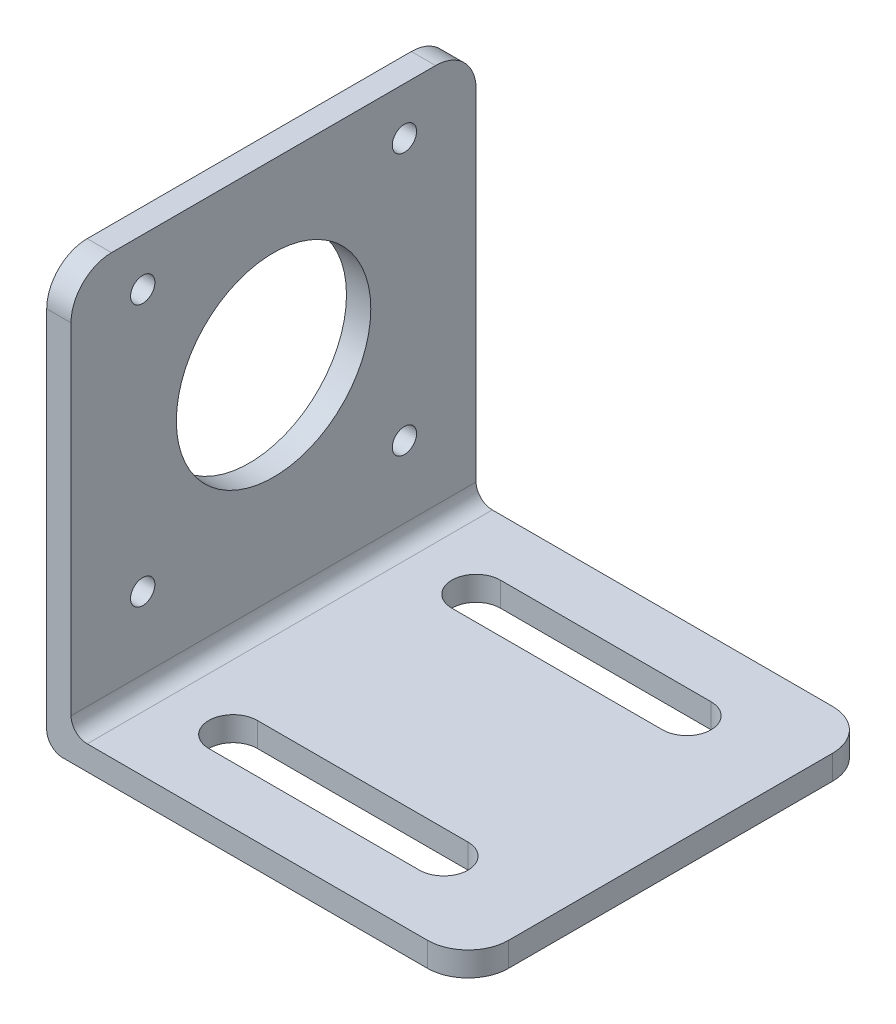
ISO-10303-21;
HEADER;
FILE_DESCRIPTION(('STEP AP214'),'2;1');
FILE_NAME('part.step','',(''),(''),'','','');
FILE_SCHEMA(('AUTOMOTIVE_DESIGN { 1 0 10303 214 1 1 1 1 }'));
ENDSEC;
DATA;
#1=APPLICATION_CONTEXT('core data for automotive mechanical design processes');
#2=APPLICATION_PROTOCOL_DEFINITION('international standard','automotive_design',2000,#1);
#3=PRODUCT_CONTEXT('',#1,'mechanical');
#4=PRODUCT('Part','Part','',(#3));
#5=PRODUCT_RELATED_PRODUCT_CATEGORY('part','',(#4));
#6=PRODUCT_DEFINITION_FORMATION('','',#4);
#7=PRODUCT_DEFINITION_CONTEXT('part definition',#1,'design');
#8=PRODUCT_DEFINITION('design','',#6,#7);
#9=PRODUCT_DEFINITION_SHAPE('','',#8);
#10=(LENGTH_UNIT() NAMED_UNIT(*) SI_UNIT(.MILLI.,.METRE.));
#11=(NAMED_UNIT(*) PLANE_ANGLE_UNIT() SI_UNIT($,.RADIAN.));
#12=(NAMED_UNIT(*) SI_UNIT($,.STERADIAN.) SOLID_ANGLE_UNIT());
#13=UNCERTAINTY_MEASURE_WITH_UNIT(LENGTH_MEASURE(1.E-05),#10,'distance_accuracy_value','');
#14=(GEOMETRIC_REPRESENTATION_CONTEXT(3) GLOBAL_UNCERTAINTY_ASSIGNED_CONTEXT((#13)) GLOBAL_UNIT_ASSIGNED_CONTEXT((#10,
#11,#12)) REPRESENTATION_CONTEXT('',''));
#15=CARTESIAN_POINT('',(0.,0.,0.));
#16=DIRECTION('',(0.,0.,1.));
#17=DIRECTION('',(1.,0.,0.));
#18=AXIS2_PLACEMENT_3D('',#15,#16,#17);
#19=CARTESIAN_POINT('',(5.,4.99999999999999,50.));
#20=DIRECTION('',(0.,0.,1.));
#21=DIRECTION('',(1.,0.,0.));
#22=AXIS2_PLACEMENT_3D('',#19,#20,#21);
#23=CYLINDRICAL_SURFACE('',#22,2.);
#24=DIRECTION('',(0.,0.,-1.));
#25=VECTOR('',#24,1.);
#26=CARTESIAN_POINT('',(3.,4.99999999999999,50.));
#27=LINE('',#26,#25);
#28=CARTESIAN_POINT('',(3.,4.99999999999999,50.));
#29=VERTEX_POINT('',#28);
#30=CARTESIAN_POINT('',(3.,4.99999999999999,0.));
#31=VERTEX_POINT('',#30);
#32=EDGE_CURVE('E322',#29,#31,#27,.T.);
#33=ORIENTED_EDGE('',*,*,#32,.F.);
#34=CARTESIAN_POINT('',(5.,4.99999999999999,50.));
#35=DIRECTION('',(0.,0.,1.));
#36=DIRECTION('',(1.,0.,0.));
#37=AXIS2_PLACEMENT_3D('',#34,#35,#36);
#38=CIRCLE('',#37,2.);
#39=CARTESIAN_POINT('',(4.99999999999998,2.99999999999999,50.));
#40=VERTEX_POINT('',#39);
#41=EDGE_CURVE('E41',#29,#40,#38,.T.);
#42=ORIENTED_EDGE('',*,*,#41,.T.);
#43=DIRECTION('',(0.,0.,-1.));
#44=VECTOR('',#43,1.);
#45=CARTESIAN_POINT('',(5.,2.99999999999999,50.));
#46=LINE('',#45,#44);
#47=CARTESIAN_POINT('',(4.99999999999998,2.99999999999999,0.));
#48=VERTEX_POINT('',#47);
#49=EDGE_CURVE('E325',#48,#40,#46,.F.);
#50=ORIENTED_EDGE('',*,*,#49,.F.);
#51=CARTESIAN_POINT('',(5.,4.99999999999999,0.));
#52=DIRECTION('',(0.,0.,1.));
#53=DIRECTION('',(1.,0.,0.));
#54=AXIS2_PLACEMENT_3D('',#51,#52,#53);
#55=CIRCLE('',#54,2.);
#56=EDGE_CURVE('E11',#48,#31,#55,.F.);
#57=ORIENTED_EDGE('',*,*,#56,.T.);
#58=EDGE_LOOP('',(#33,#42,#50,#57));
#59=FACE_BOUND('',#58,.T.);
#60=ADVANCED_FACE('F33',(#59),#23,.F.);
#61=CARTESIAN_POINT('',(0.,47.,5.));
#62=DIRECTION('',(1.,0.,0.));
#63=DIRECTION('',(0.,0.,-1.));
#64=AXIS2_PLACEMENT_3D('',#61,#62,#63);
#65=CYLINDRICAL_SURFACE('',#64,5.);
#66=DIRECTION('',(1.,0.,0.));
#67=VECTOR('',#66,1.);
#68=CARTESIAN_POINT('',(0.,47.,0.));
#69=LINE('',#68,#67);
#70=CARTESIAN_POINT('',(0.,47.,0.));
#71=VERTEX_POINT('',#70);
#72=CARTESIAN_POINT('',(3.,47.,0.));
#73=VERTEX_POINT('',#72);
#74=EDGE_CURVE('E312',#71,#73,#69,.T.);
#75=ORIENTED_EDGE('',*,*,#74,.F.);
#76=CARTESIAN_POINT('',(0.,47.,5.));
#77=DIRECTION('',(1.,0.,0.));
#78=DIRECTION('',(0.,0.,-1.));
#79=AXIS2_PLACEMENT_3D('',#76,#77,#78);
#80=CIRCLE('',#79,5.);
#81=CARTESIAN_POINT('',(0.,52.,5.));
#82=VERTEX_POINT('',#81);
#83=EDGE_CURVE('E318',#82,#71,#80,.F.);
#84=ORIENTED_EDGE('',*,*,#83,.F.);
#85=DIRECTION('',(1.,0.,0.));
#86=VECTOR('',#85,1.);
#87=CARTESIAN_POINT('',(3.,52.,5.));
#88=LINE('',#87,#86);
#89=CARTESIAN_POINT('',(3.,52.,5.));
#90=VERTEX_POINT('',#89);
#91=EDGE_CURVE('E315',#90,#82,#88,.F.);
#92=ORIENTED_EDGE('',*,*,#91,.F.);
#93=CARTESIAN_POINT('',(3.,47.,5.));
#94=DIRECTION('',(-1.,0.,0.));
#95=DIRECTION('',(0.,0.,1.));
#96=AXIS2_PLACEMENT_3D('',#93,#94,#95);
#97=CIRCLE('',#96,5.);
#98=EDGE_CURVE('E320',#73,#90,#97,.F.);
#99=ORIENTED_EDGE('',*,*,#98,.F.);
#100=EDGE_LOOP('',(#75,#84,#92,#99));
#101=FACE_BOUND('',#100,.T.);
#102=ADVANCED_FACE('F374',(#101),#65,.T.);
#103=CARTESIAN_POINT('',(47.,0.,5.));
#104=DIRECTION('',(0.,-1.,0.));
#105=DIRECTION('',(0.,0.,-1.));
#106=AXIS2_PLACEMENT_3D('',#103,#104,#105);
#107=CYLINDRICAL_SURFACE('',#106,5.);
#108=DIRECTION('',(0.,-1.,0.));
#109=VECTOR('',#108,1.);
#110=CARTESIAN_POINT('',(47.,0.,0.));
#111=LINE('',#110,#109);
#112=CARTESIAN_POINT('',(47.,3.,0.));
#113=VERTEX_POINT('',#112);
#114=CARTESIAN_POINT('',(47.,0.,0.));
#115=VERTEX_POINT('',#114);
#116=EDGE_CURVE('E302',#113,#115,#111,.T.);
#117=ORIENTED_EDGE('',*,*,#116,.F.);
#118=CARTESIAN_POINT('',(47.,3.,5.));
#119=DIRECTION('',(0.,-1.,0.));
#120=DIRECTION('',(1.,0.,0.));
#121=AXIS2_PLACEMENT_3D('',#118,#119,#120);
#122=CIRCLE('',#121,5.);
#123=CARTESIAN_POINT('',(52.,3.,5.));
#124=VERTEX_POINT('',#123);
#125=EDGE_CURVE('E308',#124,#113,#122,.F.);
#126=ORIENTED_EDGE('',*,*,#125,.F.);
#127=DIRECTION('',(0.,-1.,0.));
#128=VECTOR('',#127,1.);
#129=CARTESIAN_POINT('',(52.,0.,5.));
#130=LINE('',#129,#128);
#131=CARTESIAN_POINT('',(52.,0.,5.));
#132=VERTEX_POINT('',#131);
#133=EDGE_CURVE('E305',#132,#124,#130,.F.);
#134=ORIENTED_EDGE('',*,*,#133,.F.);
#135=CARTESIAN_POINT('',(47.,0.,5.));
#136=DIRECTION('',(0.,1.,0.));
#137=DIRECTION('',(0.,0.,1.));
#138=AXIS2_PLACEMENT_3D('',#135,#136,#137);
#139=CIRCLE('',#138,5.);
#140=EDGE_CURVE('E310',#115,#132,#139,.F.);
#141=ORIENTED_EDGE('',*,*,#140,.F.);
#142=EDGE_LOOP('',(#117,#126,#134,#141));
#143=FACE_BOUND('',#142,.T.);
#144=ADVANCED_FACE('F349',(#143),#107,.T.);
#145=CARTESIAN_POINT('',(47.,0.,45.));
#146=DIRECTION('',(0.,-1.,0.));
#147=DIRECTION('',(0.,0.,-1.));
#148=AXIS2_PLACEMENT_3D('',#145,#146,#147);
#149=CYLINDRICAL_SURFACE('',#148,5.);
#150=DIRECTION('',(0.,1.,0.));
#151=VECTOR('',#150,1.);
#152=CARTESIAN_POINT('',(47.,0.,50.));
#153=LINE('',#152,#151);
#154=CARTESIAN_POINT('',(47.,0.,50.));
#155=VERTEX_POINT('',#154);
#156=CARTESIAN_POINT('',(47.,3.,50.));
#157=VERTEX_POINT('',#156);
#158=EDGE_CURVE('E292',#155,#157,#153,.T.);
#159=ORIENTED_EDGE('',*,*,#158,.F.);
#160=CARTESIAN_POINT('',(47.,0.,45.));
#161=DIRECTION('',(0.,1.,0.));
#162=DIRECTION('',(0.,0.,1.));
#163=AXIS2_PLACEMENT_3D('',#160,#161,#162);
#164=CIRCLE('',#163,5.);
#165=CARTESIAN_POINT('',(52.,0.,45.));
#166=VERTEX_POINT('',#165);
#167=EDGE_CURVE('E298',#166,#155,#164,.F.);
#168=ORIENTED_EDGE('',*,*,#167,.F.);
#169=DIRECTION('',(0.,1.,0.));
#170=VECTOR('',#169,1.);
#171=CARTESIAN_POINT('',(52.,0.,45.));
#172=LINE('',#171,#170);
#173=CARTESIAN_POINT('',(52.,3.,45.));
#174=VERTEX_POINT('',#173);
#175=EDGE_CURVE('E295',#174,#166,#172,.F.);
#176=ORIENTED_EDGE('',*,*,#175,.F.);
#177=CARTESIAN_POINT('',(47.,3.,45.));
#178=DIRECTION('',(0.,-1.,0.));
#179=DIRECTION('',(1.,0.,0.));
#180=AXIS2_PLACEMENT_3D('',#177,#178,#179);
#181=CIRCLE('',#180,5.);
#182=EDGE_CURVE('E300',#157,#174,#181,.F.);
#183=ORIENTED_EDGE('',*,*,#182,.F.);
#184=EDGE_LOOP('',(#159,#168,#176,#183));
#185=FACE_BOUND('',#184,.T.);
#186=ADVANCED_FACE('F340',(#185),#149,.T.);
#187=CARTESIAN_POINT('',(0.,47.,45.));
#188=DIRECTION('',(1.,0.,0.));
#189=DIRECTION('',(0.,0.,-1.));
#190=AXIS2_PLACEMENT_3D('',#187,#188,#189);
#191=CYLINDRICAL_SURFACE('',#190,5.);
#192=DIRECTION('',(-1.,0.,0.));
#193=VECTOR('',#192,1.);
#194=CARTESIAN_POINT('',(0.,47.,50.));
#195=LINE('',#194,#193);
#196=CARTESIAN_POINT('',(3.,47.,50.));
#197=VERTEX_POINT('',#196);
#198=CARTESIAN_POINT('',(0.,47.,50.));
#199=VERTEX_POINT('',#198);
#200=EDGE_CURVE('E281',#197,#199,#195,.T.);
#201=ORIENTED_EDGE('',*,*,#200,.F.);
#202=CARTESIAN_POINT('',(3.,47.,45.));
#203=DIRECTION('',(-1.,0.,0.));
#204=DIRECTION('',(0.,0.,1.));
#205=AXIS2_PLACEMENT_3D('',#202,#203,#204);
#206=CIRCLE('',#205,5.);
#207=CARTESIAN_POINT('',(3.,52.,45.));
#208=VERTEX_POINT('',#207);
#209=EDGE_CURVE('E287',#208,#197,#206,.F.);
#210=ORIENTED_EDGE('',*,*,#209,.F.);
#211=DIRECTION('',(-1.,0.,0.));
#212=VECTOR('',#211,1.);
#213=CARTESIAN_POINT('',(0.,52.,45.));
#214=LINE('',#213,#212);
#215=CARTESIAN_POINT('',(0.,52.,45.));
#216=VERTEX_POINT('',#215);
#217=EDGE_CURVE('E284',#216,#208,#214,.F.);
#218=ORIENTED_EDGE('',*,*,#217,.F.);
#219=CARTESIAN_POINT('',(0.,47.,45.));
#220=DIRECTION('',(1.,0.,0.));
#221=DIRECTION('',(0.,0.,-1.));
#222=AXIS2_PLACEMENT_3D('',#219,#220,#221);
#223=CIRCLE('',#222,5.);
#224=EDGE_CURVE('E290',#199,#216,#223,.F.);
#225=ORIENTED_EDGE('',*,*,#224,.F.);
#226=EDGE_LOOP('',(#201,#210,#218,#225));
#227=FACE_BOUND('',#226,.T.);
#228=ADVANCED_FACE('F379',(#227),#191,.T.);
#229=CARTESIAN_POINT('',(2.,2.,50.));
#230=DIRECTION('',(0.,0.,1.));
#231=DIRECTION('',(1.,0.,0.));
#232=AXIS2_PLACEMENT_3D('',#229,#230,#231);
#233=CYLINDRICAL_SURFACE('',#232,2.);
#234=DIRECTION('',(0.,0.,1.));
#235=VECTOR('',#234,1.);
#236=CARTESIAN_POINT('',(0.,2.,50.));
#237=LINE('',#236,#235);
#238=CARTESIAN_POINT('',(0.,2.,0.));
#239=VERTEX_POINT('',#238);
#240=CARTESIAN_POINT('',(0.,2.,50.));
#241=VERTEX_POINT('',#240);
#242=EDGE_CURVE('E270',#239,#241,#237,.T.);
#243=ORIENTED_EDGE('',*,*,#242,.F.);
#244=CARTESIAN_POINT('',(2.,2.,0.));
#245=DIRECTION('',(0.,0.,1.));
#246=DIRECTION('',(1.,0.,0.));
#247=AXIS2_PLACEMENT_3D('',#244,#245,#246);
#248=CIRCLE('',#247,2.);
#249=CARTESIAN_POINT('',(2.,0.,0.));
#250=VERTEX_POINT('',#249);
#251=EDGE_CURVE('E276',#250,#239,#248,.F.);
#252=ORIENTED_EDGE('',*,*,#251,.F.);
#253=DIRECTION('',(0.,0.,1.));
#254=VECTOR('',#253,1.);
#255=CARTESIAN_POINT('',(2.,0.,50.));
#256=LINE('',#255,#254);
#257=CARTESIAN_POINT('',(2.,0.,50.));
#258=VERTEX_POINT('',#257);
#259=EDGE_CURVE('E273',#258,#250,#256,.F.);
#260=ORIENTED_EDGE('',*,*,#259,.F.);
#261=CARTESIAN_POINT('',(2.,2.,50.));
#262=DIRECTION('',(0.,0.,1.));
#263=DIRECTION('',(1.,0.,0.));
#264=AXIS2_PLACEMENT_3D('',#261,#262,#263);
#265=CIRCLE('',#264,2.);
#266=EDGE_CURVE('E279',#241,#258,#265,.T.);
#267=ORIENTED_EDGE('',*,*,#266,.F.);
#268=EDGE_LOOP('',(#243,#252,#260,#267));
#269=FACE_BOUND('',#268,.T.);
#270=ADVANCED_FACE('F368',(#269),#233,.T.);
#271=CARTESIAN_POINT('',(0.,0.,50.));
#272=DIRECTION('',(1.,0.,0.));
#273=DIRECTION('',(0.,0.,-1.));
#274=AXIS2_PLACEMENT_3D('',#271,#272,#273);
#275=PLANE('',#274);
#276=CARTESIAN_POINT('',(0.,46.1500000000004,41.15));
#277=DIRECTION('',(1.,0.,0.));
#278=DIRECTION('',(0.,0.,-1.));
#279=AXIS2_PLACEMENT_3D('',#276,#277,#278);
#280=CIRCLE('',#279,1.5);
#281=CARTESIAN_POINT('',(0.,46.1500000000004,39.65));
#282=VERTEX_POINT('',#281);
#283=EDGE_CURVE('E612',#282,#282,#280,.T.);
#284=ORIENTED_EDGE('',*,*,#283,.T.);
#285=EDGE_LOOP('',(#284));
#286=FACE_BOUND('',#285,.T.);
#287=CARTESIAN_POINT('',(0.,13.8500000000004,8.85000000000002));
#288=DIRECTION('',(1.,0.,0.));
#289=DIRECTION('',(0.,0.,-1.));
#290=AXIS2_PLACEMENT_3D('',#287,#288,#289);
#291=CIRCLE('',#290,1.5);
#292=CARTESIAN_POINT('',(0.,13.8500000000004,7.35000000000002));
#293=VERTEX_POINT('',#292);
#294=EDGE_CURVE('E614',#293,#293,#291,.T.);
#295=ORIENTED_EDGE('',*,*,#294,.T.);
#296=EDGE_LOOP('',(#295));
#297=FACE_BOUND('',#296,.T.);
#298=CARTESIAN_POINT('',(0.,13.8500000000004,41.15));
#299=DIRECTION('',(1.,0.,0.));
#300=DIRECTION('',(0.,0.,-1.));
#301=AXIS2_PLACEMENT_3D('',#298,#299,#300);
#302=CIRCLE('',#301,1.5);
#303=CARTESIAN_POINT('',(0.,13.8500000000004,39.65));
#304=VERTEX_POINT('',#303);
#305=EDGE_CURVE('E620',#304,#304,#302,.T.);
#306=ORIENTED_EDGE('',*,*,#305,.T.);
#307=EDGE_LOOP('',(#306));
#308=FACE_BOUND('',#307,.T.);
#309=CARTESIAN_POINT('',(0.,46.1500000000004,8.85000000000002));
#310=DIRECTION('',(1.,0.,0.));
#311=DIRECTION('',(0.,0.,-1.));
#312=AXIS2_PLACEMENT_3D('',#309,#310,#311);
#313=CIRCLE('',#312,1.5);
#314=CARTESIAN_POINT('',(0.,46.1500000000004,7.35000000000002));
#315=VERTEX_POINT('',#314);
#316=EDGE_CURVE('E617',#315,#315,#313,.T.);
#317=ORIENTED_EDGE('',*,*,#316,.T.);
#318=EDGE_LOOP('',(#317));
#319=FACE_BOUND('',#318,.T.);
#320=CARTESIAN_POINT('',(0.,30.,25.));
#321=DIRECTION('',(-1.,0.,0.));
#322=DIRECTION('',(0.,0.,1.));
#323=AXIS2_PLACEMENT_3D('',#320,#321,#322);
#324=CIRCLE('',#323,12.);
#325=CARTESIAN_POINT('',(0.,30.,37.));
#326=VERTEX_POINT('',#325);
#327=EDGE_CURVE('E626',#326,#326,#324,.T.);
#328=ORIENTED_EDGE('',*,*,#327,.F.);
#329=EDGE_LOOP('',(#328));
#330=FACE_BOUND('',#329,.T.);
#331=DIRECTION('',(0.,0.,-1.));
#332=VECTOR('',#331,1.);
#333=CARTESIAN_POINT('',(0.,52.,50.));
#334=LINE('',#333,#332);
#335=EDGE_CURVE('E250',#216,#82,#334,.T.);
#336=ORIENTED_EDGE('',*,*,#335,.T.);
#337=ORIENTED_EDGE('',*,*,#83,.T.);
#338=DIRECTION('',(0.,-1.,0.));
#339=VECTOR('',#338,1.);
#340=CARTESIAN_POINT('',(0.,0.,0.));
#341=LINE('',#340,#339);
#342=EDGE_CURVE('E238',#71,#239,#341,.T.);
#343=ORIENTED_EDGE('',*,*,#342,.T.);
#344=ORIENTED_EDGE('',*,*,#242,.T.);
#345=DIRECTION('',(0.,-1.,0.));
#346=VECTOR('',#345,1.);
#347=CARTESIAN_POINT('',(0.,0.,50.));
#348=LINE('',#347,#346);
#349=EDGE_CURVE('E239',#199,#241,#348,.T.);
#350=ORIENTED_EDGE('',*,*,#349,.F.);
#351=ORIENTED_EDGE('',*,*,#224,.T.);
#352=EDGE_LOOP('',(#336,#337,#343,#344,#350,#351));
#353=FACE_BOUND('',#352,.T.);
#354=ADVANCED_FACE('F364',(#286,#297,#308,#319,#330,#353),#275,.F.);
#355=CARTESIAN_POINT('',(0.,0.,50.));
#356=DIRECTION('',(0.,1.,0.));
#357=DIRECTION('',(0.,0.,1.));
#358=AXIS2_PLACEMENT_3D('',#355,#356,#357);
#359=PLANE('',#358);
#360=DIRECTION('',(-1.,0.,0.));
#361=VECTOR('',#360,1.);
#362=CARTESIAN_POINT('',(0.,0.,7.));
#363=LINE('',#362,#361);
#364=CARTESIAN_POINT('',(39.,0.,7.));
#365=VERTEX_POINT('',#364);
#366=CARTESIAN_POINT('',(13.,0.,7.));
#367=VERTEX_POINT('',#366);
#368=EDGE_CURVE('E200',#365,#367,#363,.T.);
#369=ORIENTED_EDGE('',*,*,#368,.T.);
#370=CARTESIAN_POINT('',(13.,0.,10.));
#371=DIRECTION('',(0.,1.,0.));
#372=DIRECTION('',(0.,0.,1.));
#373=AXIS2_PLACEMENT_3D('',#370,#371,#372);
#374=CIRCLE('',#373,3.);
#375=CARTESIAN_POINT('',(13.,0.,13.));
#376=VERTEX_POINT('',#375);
#377=EDGE_CURVE('E203',#367,#376,#374,.T.);
#378=ORIENTED_EDGE('',*,*,#377,.T.);
#379=DIRECTION('',(1.,0.,0.));
#380=VECTOR('',#379,1.);
#381=CARTESIAN_POINT('',(0.,0.,13.));
#382=LINE('',#381,#380);
#383=CARTESIAN_POINT('',(39.,0.,13.));
#384=VERTEX_POINT('',#383);
#385=EDGE_CURVE('E195',#376,#384,#382,.T.);
#386=ORIENTED_EDGE('',*,*,#385,.T.);
#387=CARTESIAN_POINT('',(39.,0.,10.));
#388=DIRECTION('',(0.,1.,0.));
#389=DIRECTION('',(0.,0.,1.));
#390=AXIS2_PLACEMENT_3D('',#387,#388,#389);
#391=CIRCLE('',#390,3.);
#392=EDGE_CURVE('E175',#384,#365,#391,.T.);
#393=ORIENTED_EDGE('',*,*,#392,.T.);
#394=EDGE_LOOP('',(#369,#378,#386,#393));
#395=FACE_BOUND('',#394,.T.);
#396=DIRECTION('',(1.,0.,0.));
#397=VECTOR('',#396,1.);
#398=CARTESIAN_POINT('',(0.,0.,43.));
#399=LINE('',#398,#397);
#400=CARTESIAN_POINT('',(13.,0.,43.));
#401=VERTEX_POINT('',#400);
#402=CARTESIAN_POINT('',(39.,0.,43.));
#403=VERTEX_POINT('',#402);
#404=EDGE_CURVE('E232',#401,#403,#399,.T.);
#405=ORIENTED_EDGE('',*,*,#404,.T.);
#406=CARTESIAN_POINT('',(39.,0.,40.));
#407=DIRECTION('',(0.,1.,0.));
#408=DIRECTION('',(0.,0.,1.));
#409=AXIS2_PLACEMENT_3D('',#406,#407,#408);
#410=CIRCLE('',#409,2.99999999999999);
#411=CARTESIAN_POINT('',(39.,0.,37.));
#412=VERTEX_POINT('',#411);
#413=EDGE_CURVE('E235',#403,#412,#410,.T.);
#414=ORIENTED_EDGE('',*,*,#413,.T.);
#415=DIRECTION('',(-1.,0.,0.));
#416=VECTOR('',#415,1.);
#417=CARTESIAN_POINT('',(0.,0.,37.));
#418=LINE('',#417,#416);
#419=CARTESIAN_POINT('',(13.,0.,37.));
#420=VERTEX_POINT('',#419);
#421=EDGE_CURVE('E220',#412,#420,#418,.T.);
#422=ORIENTED_EDGE('',*,*,#421,.T.);
#423=CARTESIAN_POINT('',(13.,0.,40.));
#424=DIRECTION('',(0.,1.,0.));
#425=DIRECTION('',(0.,0.,1.));
#426=AXIS2_PLACEMENT_3D('',#423,#424,#425);
#427=CIRCLE('',#426,3.);
#428=EDGE_CURVE('E229',#420,#401,#427,.T.);
#429=ORIENTED_EDGE('',*,*,#428,.T.);
#430=EDGE_LOOP('',(#405,#414,#422,#429));
#431=FACE_BOUND('',#430,.T.);
#432=DIRECTION('',(1.,0.,0.));
#433=VECTOR('',#432,1.);
#434=CARTESIAN_POINT('',(0.,0.,0.));
#435=LINE('',#434,#433);
#436=EDGE_CURVE('E252',#250,#115,#435,.T.);
#437=ORIENTED_EDGE('',*,*,#436,.T.);
#438=ORIENTED_EDGE('',*,*,#140,.T.);
#439=DIRECTION('',(0.,0.,-1.));
#440=VECTOR('',#439,1.);
#441=CARTESIAN_POINT('',(52.,0.,50.));
#442=LINE('',#441,#440);
#443=EDGE_CURVE('E267',#166,#132,#442,.T.);
#444=ORIENTED_EDGE('',*,*,#443,.F.);
#445=ORIENTED_EDGE('',*,*,#167,.T.);
#446=DIRECTION('',(1.,0.,0.));
#447=VECTOR('',#446,1.);
#448=CARTESIAN_POINT('',(0.,0.,50.));
#449=LINE('',#448,#447);
#450=EDGE_CURVE('E241',#258,#155,#449,.T.);
#451=ORIENTED_EDGE('',*,*,#450,.F.);
#452=ORIENTED_EDGE('',*,*,#259,.T.);
#453=EDGE_LOOP('',(#437,#438,#444,#445,#451,#452));
#454=FACE_BOUND('',#453,.T.);
#455=ADVANCED_FACE('F371',(#395,#431,#454),#359,.F.);
#456=CARTESIAN_POINT('',(52.,0.,50.));
#457=DIRECTION('',(-1.,0.,0.));
#458=DIRECTION('',(0.,0.,1.));
#459=AXIS2_PLACEMENT_3D('',#456,#457,#458);
#460=PLANE('',#459);
#461=ORIENTED_EDGE('',*,*,#443,.T.);
#462=ORIENTED_EDGE('',*,*,#133,.T.);
#463=DIRECTION('',(0.,0.,-1.));
#464=VECTOR('',#463,1.);
#465=CARTESIAN_POINT('',(52.,3.,50.));
#466=LINE('',#465,#464);
#467=EDGE_CURVE('E264',#174,#124,#466,.T.);
#468=ORIENTED_EDGE('',*,*,#467,.F.);
#469=ORIENTED_EDGE('',*,*,#175,.T.);
#470=EDGE_LOOP('',(#461,#462,#468,#469));
#471=FACE_BOUND('',#470,.T.);
#472=ADVANCED_FACE('F345',(#471),#460,.F.);
#473=CARTESIAN_POINT('',(52.,3.,50.));
#474=DIRECTION('',(0.,-1.,0.));
#475=DIRECTION('',(1.,0.,0.));
#476=AXIS2_PLACEMENT_3D('',#473,#474,#475);
#477=PLANE('',#476);
#478=DIRECTION('',(1.,0.,0.));
#479=VECTOR('',#478,1.);
#480=CARTESIAN_POINT('',(13.,2.99999999999999,13.));
#481=LINE('',#480,#479);
#482=CARTESIAN_POINT('',(13.,2.99999999999999,13.));
#483=VERTEX_POINT('',#482);
#484=CARTESIAN_POINT('',(39.,3.,13.));
#485=VERTEX_POINT('',#484);
#486=EDGE_CURVE('E181',#483,#485,#481,.T.);
#487=ORIENTED_EDGE('',*,*,#486,.F.);
#488=CARTESIAN_POINT('',(13.,2.99999999999999,10.));
#489=DIRECTION('',(0.,1.,0.));
#490=DIRECTION('',(-1.,0.,0.));
#491=AXIS2_PLACEMENT_3D('',#488,#489,#490);
#492=CIRCLE('',#491,3.);
#493=CARTESIAN_POINT('',(13.,2.99999999999999,7.));
#494=VERTEX_POINT('',#493);
#495=EDGE_CURVE('E56',#494,#483,#492,.T.);
#496=ORIENTED_EDGE('',*,*,#495,.F.);
#497=DIRECTION('',(-1.,0.,0.));
#498=VECTOR('',#497,1.);
#499=CARTESIAN_POINT('',(13.,2.99999999999999,7.));
#500=LINE('',#499,#498);
#501=CARTESIAN_POINT('',(39.,3.,7.));
#502=VERTEX_POINT('',#501);
#503=EDGE_CURVE('E188',#502,#494,#500,.T.);
#504=ORIENTED_EDGE('',*,*,#503,.F.);
#505=CARTESIAN_POINT('',(39.,3.,10.));
#506=DIRECTION('',(0.,1.,0.));
#507=DIRECTION('',(-1.,0.,0.));
#508=AXIS2_PLACEMENT_3D('',#505,#506,#507);
#509=CIRCLE('',#508,3.);
#510=EDGE_CURVE('E172',#485,#502,#509,.T.);
#511=ORIENTED_EDGE('',*,*,#510,.F.);
#512=EDGE_LOOP('',(#487,#496,#504,#511));
#513=FACE_BOUND('',#512,.T.);
#514=DIRECTION('',(-1.,0.,0.));
#515=VECTOR('',#514,1.);
#516=CARTESIAN_POINT('',(39.,3.,37.));
#517=LINE('',#516,#515);
#518=CARTESIAN_POINT('',(39.,3.,37.));
#519=VERTEX_POINT('',#518);
#520=CARTESIAN_POINT('',(13.,2.99999999999999,37.));
#521=VERTEX_POINT('',#520);
#522=EDGE_CURVE('E208',#519,#521,#517,.T.);
#523=ORIENTED_EDGE('',*,*,#522,.F.);
#524=CARTESIAN_POINT('',(39.,3.,40.));
#525=DIRECTION('',(0.,1.,0.));
#526=DIRECTION('',(-1.,0.,0.));
#527=AXIS2_PLACEMENT_3D('',#524,#525,#526);
#528=CIRCLE('',#527,2.99999999999999);
#529=CARTESIAN_POINT('',(39.,3.,43.));
#530=VERTEX_POINT('',#529);
#531=EDGE_CURVE('E206',#530,#519,#528,.T.);
#532=ORIENTED_EDGE('',*,*,#531,.F.);
#533=DIRECTION('',(1.,0.,0.));
#534=VECTOR('',#533,1.);
#535=CARTESIAN_POINT('',(39.,3.,43.));
#536=LINE('',#535,#534);
#537=CARTESIAN_POINT('',(13.,2.99999999999999,43.));
#538=VERTEX_POINT('',#537);
#539=EDGE_CURVE('E214',#538,#530,#536,.T.);
#540=ORIENTED_EDGE('',*,*,#539,.F.);
#541=CARTESIAN_POINT('',(13.,2.99999999999999,40.));
#542=DIRECTION('',(0.,1.,0.));
#543=DIRECTION('',(-1.,0.,0.));
#544=AXIS2_PLACEMENT_3D('',#541,#542,#543);
#545=CIRCLE('',#544,3.);
#546=EDGE_CURVE('E211',#521,#538,#545,.T.);
#547=ORIENTED_EDGE('',*,*,#546,.F.);
#548=EDGE_LOOP('',(#523,#532,#540,#547));
#549=FACE_BOUND('',#548,.T.);
#550=DIRECTION('',(-1.,0.,0.));
#551=VECTOR('',#550,1.);
#552=CARTESIAN_POINT('',(52.,3.,0.));
#553=LINE('',#552,#551);
#554=EDGE_CURVE('E255',#113,#48,#553,.T.);
#555=ORIENTED_EDGE('',*,*,#554,.T.);
#556=ORIENTED_EDGE('',*,*,#49,.T.);
#557=DIRECTION('',(-1.,0.,0.));
#558=VECTOR('',#557,1.);
#559=CARTESIAN_POINT('',(52.,3.,50.));
#560=LINE('',#559,#558);
#561=EDGE_CURVE('E245',#157,#40,#560,.T.);
#562=ORIENTED_EDGE('',*,*,#561,.F.);
#563=ORIENTED_EDGE('',*,*,#182,.T.);
#564=ORIENTED_EDGE('',*,*,#467,.T.);
#565=ORIENTED_EDGE('',*,*,#125,.T.);
#566=EDGE_LOOP('',(#555,#556,#562,#563,#564,#565));
#567=FACE_BOUND('',#566,.T.);
#568=ADVANCED_FACE('F185',(#513,#549,#567),#477,.F.);
#569=CARTESIAN_POINT('',(3.,2.99999999999999,50.));
#570=DIRECTION('',(-1.,0.,0.));
#571=DIRECTION('',(0.,0.,1.));
#572=AXIS2_PLACEMENT_3D('',#569,#570,#571);
#573=PLANE('',#572);
#574=CARTESIAN_POINT('',(3.,46.1500000000004,41.15));
#575=DIRECTION('',(1.,0.,0.));
#576=DIRECTION('',(0.,0.,-1.));
#577=AXIS2_PLACEMENT_3D('',#574,#575,#576);
#578=CIRCLE('',#577,1.5);
#579=CARTESIAN_POINT('',(3.,46.1500000000004,39.65));
#580=VERTEX_POINT('',#579);
#581=EDGE_CURVE('E609',#580,#580,#578,.T.);
#582=ORIENTED_EDGE('',*,*,#581,.F.);
#583=EDGE_LOOP('',(#582));
#584=FACE_BOUND('',#583,.T.);
#585=CARTESIAN_POINT('',(3.,13.8500000000004,8.85000000000002));
#586=DIRECTION('',(1.,0.,0.));
#587=DIRECTION('',(0.,0.,-1.));
#588=AXIS2_PLACEMENT_3D('',#585,#586,#587);
#589=CIRCLE('',#588,1.5);
#590=CARTESIAN_POINT('',(3.,13.8500000000004,7.35000000000002));
#591=VERTEX_POINT('',#590);
#592=EDGE_CURVE('E642',#591,#591,#589,.T.);
#593=ORIENTED_EDGE('',*,*,#592,.F.);
#594=EDGE_LOOP('',(#593));
#595=FACE_BOUND('',#594,.T.);
#596=CARTESIAN_POINT('',(3.,13.8500000000004,41.15));
#597=DIRECTION('',(1.,0.,0.));
#598=DIRECTION('',(0.,0.,-1.));
#599=AXIS2_PLACEMENT_3D('',#596,#597,#598);
#600=CIRCLE('',#599,1.5);
#601=CARTESIAN_POINT('',(3.,13.8500000000004,39.65));
#602=VERTEX_POINT('',#601);
#603=EDGE_CURVE('E639',#602,#602,#600,.T.);
#604=ORIENTED_EDGE('',*,*,#603,.F.);
#605=EDGE_LOOP('',(#604));
#606=FACE_BOUND('',#605,.T.);
#607=CARTESIAN_POINT('',(3.,46.1500000000004,8.85000000000002));
#608=DIRECTION('',(1.,0.,0.));
#609=DIRECTION('',(0.,0.,-1.));
#610=AXIS2_PLACEMENT_3D('',#607,#608,#609);
#611=CIRCLE('',#610,1.5);
#612=CARTESIAN_POINT('',(3.,46.1500000000004,7.35000000000002));
#613=VERTEX_POINT('',#612);
#614=EDGE_CURVE('E613',#613,#613,#611,.T.);
#615=ORIENTED_EDGE('',*,*,#614,.F.);
#616=EDGE_LOOP('',(#615));
#617=FACE_BOUND('',#616,.T.);
#618=CARTESIAN_POINT('',(3.,30.,25.));
#619=DIRECTION('',(-1.,0.,0.));
#620=DIRECTION('',(0.,0.,1.));
#621=AXIS2_PLACEMENT_3D('',#618,#619,#620);
#622=CIRCLE('',#621,12.);
#623=CARTESIAN_POINT('',(3.,30.,37.));
#624=VERTEX_POINT('',#623);
#625=EDGE_CURVE('E36',#624,#624,#622,.T.);
#626=ORIENTED_EDGE('',*,*,#625,.T.);
#627=EDGE_LOOP('',(#626));
#628=FACE_BOUND('',#627,.T.);
#629=DIRECTION('',(0.,1.,0.));
#630=VECTOR('',#629,1.);
#631=CARTESIAN_POINT('',(3.,2.99999999999999,50.));
#632=LINE('',#631,#630);
#633=EDGE_CURVE('E248',#29,#197,#632,.T.);
#634=ORIENTED_EDGE('',*,*,#633,.F.);
#635=ORIENTED_EDGE('',*,*,#32,.T.);
#636=DIRECTION('',(0.,1.,0.));
#637=VECTOR('',#636,1.);
#638=CARTESIAN_POINT('',(3.,2.99999999999999,0.));
#639=LINE('',#638,#637);
#640=EDGE_CURVE('E242',#31,#73,#639,.T.);
#641=ORIENTED_EDGE('',*,*,#640,.T.);
#642=ORIENTED_EDGE('',*,*,#98,.T.);
#643=DIRECTION('',(0.,0.,-1.));
#644=VECTOR('',#643,1.);
#645=CARTESIAN_POINT('',(3.,52.,50.));
#646=LINE('',#645,#644);
#647=EDGE_CURVE('E261',#208,#90,#646,.T.);
#648=ORIENTED_EDGE('',*,*,#647,.F.);
#649=ORIENTED_EDGE('',*,*,#209,.T.);
#650=EDGE_LOOP('',(#634,#635,#641,#642,#648,#649));
#651=FACE_BOUND('',#650,.T.);
#652=ADVANCED_FACE('F356',(#584,#595,#606,#617,#628,#651),#573,.F.);
#653=CARTESIAN_POINT('',(3.,52.,50.));
#654=DIRECTION('',(0.,-1.,0.));
#655=DIRECTION('',(0.,0.,-1.));
#656=AXIS2_PLACEMENT_3D('',#653,#654,#655);
#657=PLANE('',#656);
#658=ORIENTED_EDGE('',*,*,#647,.T.);
#659=ORIENTED_EDGE('',*,*,#91,.T.);
#660=ORIENTED_EDGE('',*,*,#335,.F.);
#661=ORIENTED_EDGE('',*,*,#217,.T.);
#662=EDGE_LOOP('',(#658,#659,#660,#661));
#663=FACE_BOUND('',#662,.T.);
#664=ADVANCED_FACE('F377',(#663),#657,.F.);
#665=CARTESIAN_POINT('',(0.,0.,50.));
#666=DIRECTION('',(0.,0.,1.));
#667=DIRECTION('',(1.,0.,0.));
#668=AXIS2_PLACEMENT_3D('',#665,#666,#667);
#669=PLANE('',#668);
#670=ORIENTED_EDGE('',*,*,#41,.F.);
#671=ORIENTED_EDGE('',*,*,#633,.T.);
#672=ORIENTED_EDGE('',*,*,#200,.T.);
#673=ORIENTED_EDGE('',*,*,#349,.T.);
#674=ORIENTED_EDGE('',*,*,#266,.T.);
#675=ORIENTED_EDGE('',*,*,#450,.T.);
#676=ORIENTED_EDGE('',*,*,#158,.T.);
#677=ORIENTED_EDGE('',*,*,#561,.T.);
#678=EDGE_LOOP('',(#670,#671,#672,#673,#674,#675,#676,#677));
#679=FACE_BOUND('',#678,.T.);
#680=ADVANCED_FACE('F336',(#679),#669,.T.);
#681=CARTESIAN_POINT('',(0.,0.,0.));
#682=DIRECTION('',(0.,0.,1.));
#683=DIRECTION('',(1.,0.,0.));
#684=AXIS2_PLACEMENT_3D('',#681,#682,#683);
#685=PLANE('',#684);
#686=ORIENTED_EDGE('',*,*,#342,.F.);
#687=ORIENTED_EDGE('',*,*,#74,.T.);
#688=ORIENTED_EDGE('',*,*,#640,.F.);
#689=ORIENTED_EDGE('',*,*,#56,.F.);
#690=ORIENTED_EDGE('',*,*,#554,.F.);
#691=ORIENTED_EDGE('',*,*,#116,.T.);
#692=ORIENTED_EDGE('',*,*,#436,.F.);
#693=ORIENTED_EDGE('',*,*,#251,.T.);
#694=EDGE_LOOP('',(#686,#687,#688,#689,#690,#691,#692,#693));
#695=FACE_BOUND('',#694,.T.);
#696=ADVANCED_FACE('F353',(#695),#685,.F.);
#697=CARTESIAN_POINT('',(39.,-47.,40.));
#698=DIRECTION('',(0.,1.,0.));
#699=DIRECTION('',(-1.,0.,0.));
#700=AXIS2_PLACEMENT_3D('',#697,#698,#699);
#701=CYLINDRICAL_SURFACE('',#700,2.99999999999999);
#702=DIRECTION('',(0.,1.,0.));
#703=VECTOR('',#702,1.);
#704=CARTESIAN_POINT('',(39.,-47.,43.));
#705=LINE('',#704,#703);
#706=EDGE_CURVE('E218',#403,#530,#705,.T.);
#707=ORIENTED_EDGE('',*,*,#706,.T.);
#708=ORIENTED_EDGE('',*,*,#531,.T.);
#709=DIRECTION('',(0.,1.,0.));
#710=VECTOR('',#709,1.);
#711=CARTESIAN_POINT('',(39.,-47.,37.));
#712=LINE('',#711,#710);
#713=EDGE_CURVE('E217',#412,#519,#712,.T.);
#714=ORIENTED_EDGE('',*,*,#713,.F.);
#715=ORIENTED_EDGE('',*,*,#413,.F.);
#716=EDGE_LOOP('',(#707,#708,#714,#715));
#717=FACE_BOUND('',#716,.T.);
#718=ADVANCED_FACE('F473',(#717),#701,.F.);
#719=CARTESIAN_POINT('',(39.,-47.,43.));
#720=DIRECTION('',(0.,0.,1.));
#721=DIRECTION('',(1.,0.,0.));
#722=AXIS2_PLACEMENT_3D('',#719,#720,#721);
#723=PLANE('',#722);
#724=DIRECTION('',(0.,1.,0.));
#725=VECTOR('',#724,1.);
#726=CARTESIAN_POINT('',(13.,-47.,43.));
#727=LINE('',#726,#725);
#728=EDGE_CURVE('E221',#401,#538,#727,.T.);
#729=ORIENTED_EDGE('',*,*,#728,.T.);
#730=ORIENTED_EDGE('',*,*,#539,.T.);
#731=ORIENTED_EDGE('',*,*,#706,.F.);
#732=ORIENTED_EDGE('',*,*,#404,.F.);
#733=EDGE_LOOP('',(#729,#730,#731,#732));
#734=FACE_BOUND('',#733,.T.);
#735=ADVANCED_FACE('F478',(#734),#723,.F.);
#736=CARTESIAN_POINT('',(13.,-47.,40.));
#737=DIRECTION('',(0.,1.,0.));
#738=DIRECTION('',(-1.,0.,0.));
#739=AXIS2_PLACEMENT_3D('',#736,#737,#738);
#740=CYLINDRICAL_SURFACE('',#739,3.);
#741=DIRECTION('',(0.,1.,0.));
#742=VECTOR('',#741,1.);
#743=CARTESIAN_POINT('',(13.,-47.,37.));
#744=LINE('',#743,#742);
#745=EDGE_CURVE('E223',#420,#521,#744,.T.);
#746=ORIENTED_EDGE('',*,*,#745,.T.);
#747=ORIENTED_EDGE('',*,*,#546,.T.);
#748=ORIENTED_EDGE('',*,*,#728,.F.);
#749=ORIENTED_EDGE('',*,*,#428,.F.);
#750=EDGE_LOOP('',(#746,#747,#748,#749));
#751=FACE_BOUND('',#750,.T.);
#752=ADVANCED_FACE('F486',(#751),#740,.F.);
#753=CARTESIAN_POINT('',(39.,-47.,37.));
#754=DIRECTION('',(0.,0.,-1.));
#755=DIRECTION('',(-1.,0.,0.));
#756=AXIS2_PLACEMENT_3D('',#753,#754,#755);
#757=PLANE('',#756);
#758=ORIENTED_EDGE('',*,*,#713,.T.);
#759=ORIENTED_EDGE('',*,*,#522,.T.);
#760=ORIENTED_EDGE('',*,*,#745,.F.);
#761=ORIENTED_EDGE('',*,*,#421,.F.);
#762=EDGE_LOOP('',(#758,#759,#760,#761));
#763=FACE_BOUND('',#762,.T.);
#764=ADVANCED_FACE('F494',(#763),#757,.F.);
#765=CARTESIAN_POINT('',(13.,-47.,10.));
#766=DIRECTION('',(0.,1.,0.));
#767=DIRECTION('',(-1.,0.,0.));
#768=AXIS2_PLACEMENT_3D('',#765,#766,#767);
#769=CYLINDRICAL_SURFACE('',#768,3.);
#770=DIRECTION('',(0.,1.,0.));
#771=VECTOR('',#770,1.);
#772=CARTESIAN_POINT('',(13.,-47.,7.));
#773=LINE('',#772,#771);
#774=EDGE_CURVE('E193',#367,#494,#773,.T.);
#775=ORIENTED_EDGE('',*,*,#774,.T.);
#776=ORIENTED_EDGE('',*,*,#495,.T.);
#777=DIRECTION('',(0.,1.,0.));
#778=VECTOR('',#777,1.);
#779=CARTESIAN_POINT('',(13.,-47.,13.));
#780=LINE('',#779,#778);
#781=EDGE_CURVE('E178',#376,#483,#780,.T.);
#782=ORIENTED_EDGE('',*,*,#781,.F.);
#783=ORIENTED_EDGE('',*,*,#377,.F.);
#784=EDGE_LOOP('',(#775,#776,#782,#783));
#785=FACE_BOUND('',#784,.T.);
#786=ADVANCED_FACE('F502',(#785),#769,.F.);
#787=CARTESIAN_POINT('',(13.,-47.,7.));
#788=DIRECTION('',(0.,0.,-1.));
#789=DIRECTION('',(-1.,0.,0.));
#790=AXIS2_PLACEMENT_3D('',#787,#788,#789);
#791=PLANE('',#790);
#792=DIRECTION('',(0.,1.,0.));
#793=VECTOR('',#792,1.);
#794=CARTESIAN_POINT('',(39.,-47.,7.));
#795=LINE('',#794,#793);
#796=EDGE_CURVE('E177',#365,#502,#795,.T.);
#797=ORIENTED_EDGE('',*,*,#796,.T.);
#798=ORIENTED_EDGE('',*,*,#503,.T.);
#799=ORIENTED_EDGE('',*,*,#774,.F.);
#800=ORIENTED_EDGE('',*,*,#368,.F.);
#801=EDGE_LOOP('',(#797,#798,#799,#800));
#802=FACE_BOUND('',#801,.T.);
#803=ADVANCED_FACE('F510',(#802),#791,.F.);
#804=CARTESIAN_POINT('',(39.,-47.,10.));
#805=DIRECTION('',(0.,1.,0.));
#806=DIRECTION('',(-1.,0.,0.));
#807=AXIS2_PLACEMENT_3D('',#804,#805,#806);
#808=CYLINDRICAL_SURFACE('',#807,3.);
#809=DIRECTION('',(0.,1.,0.));
#810=VECTOR('',#809,1.);
#811=CARTESIAN_POINT('',(39.,-47.,13.));
#812=LINE('',#811,#810);
#813=EDGE_CURVE('E48',#384,#485,#812,.T.);
#814=ORIENTED_EDGE('',*,*,#813,.T.);
#815=ORIENTED_EDGE('',*,*,#510,.T.);
#816=ORIENTED_EDGE('',*,*,#796,.F.);
#817=ORIENTED_EDGE('',*,*,#392,.F.);
#818=EDGE_LOOP('',(#814,#815,#816,#817));
#819=FACE_BOUND('',#818,.T.);
#820=ADVANCED_FACE('F169',(#819),#808,.F.);
#821=CARTESIAN_POINT('',(13.,-47.,13.));
#822=DIRECTION('',(0.,0.,1.));
#823=DIRECTION('',(1.,0.,0.));
#824=AXIS2_PLACEMENT_3D('',#821,#822,#823);
#825=PLANE('',#824);
#826=ORIENTED_EDGE('',*,*,#781,.T.);
#827=ORIENTED_EDGE('',*,*,#486,.T.);
#828=ORIENTED_EDGE('',*,*,#813,.F.);
#829=ORIENTED_EDGE('',*,*,#385,.F.);
#830=EDGE_LOOP('',(#826,#827,#828,#829));
#831=FACE_BOUND('',#830,.T.);
#832=ADVANCED_FACE('F182',(#831),#825,.F.);
#833=CARTESIAN_POINT('',(50.,30.,25.));
#834=DIRECTION('',(-1.,0.,0.));
#835=DIRECTION('',(0.,0.,1.));
#836=AXIS2_PLACEMENT_3D('',#833,#834,#835);
#837=CYLINDRICAL_SURFACE('',#836,12.);
#838=ORIENTED_EDGE('',*,*,#327,.T.);
#839=EDGE_LOOP('',(#838));
#840=FACE_BOUND('',#839,.T.);
#841=ORIENTED_EDGE('',*,*,#625,.F.);
#842=EDGE_LOOP('',(#841));
#843=FACE_BOUND('',#842,.T.);
#844=ADVANCED_FACE('F530',(#840,#843),#837,.F.);
#845=CARTESIAN_POINT('',(-7.,46.1500000000004,8.85000000000002));
#846=DIRECTION('',(1.,0.,0.));
#847=DIRECTION('',(0.,0.,-1.));
#848=AXIS2_PLACEMENT_3D('',#845,#846,#847);
#849=CYLINDRICAL_SURFACE('',#848,1.5);
#850=ORIENTED_EDGE('',*,*,#614,.T.);
#851=EDGE_LOOP('',(#850));
#852=FACE_BOUND('',#851,.T.);
#853=ORIENTED_EDGE('',*,*,#316,.F.);
#854=EDGE_LOOP('',(#853));
#855=FACE_BOUND('',#854,.T.);
#856=ADVANCED_FACE('F536',(#852,#855),#849,.F.);
#857=CARTESIAN_POINT('',(-7.,13.8500000000004,41.15));
#858=DIRECTION('',(1.,0.,0.));
#859=DIRECTION('',(0.,0.,-1.));
#860=AXIS2_PLACEMENT_3D('',#857,#858,#859);
#861=CYLINDRICAL_SURFACE('',#860,1.5);
#862=ORIENTED_EDGE('',*,*,#603,.T.);
#863=EDGE_LOOP('',(#862));
#864=FACE_BOUND('',#863,.T.);
#865=ORIENTED_EDGE('',*,*,#305,.F.);
#866=EDGE_LOOP('',(#865));
#867=FACE_BOUND('',#866,.T.);
#868=ADVANCED_FACE('F543',(#864,#867),#861,.F.);
#869=CARTESIAN_POINT('',(-7.,13.8500000000004,8.85000000000002));
#870=DIRECTION('',(1.,0.,0.));
#871=DIRECTION('',(0.,0.,-1.));
#872=AXIS2_PLACEMENT_3D('',#869,#870,#871);
#873=CYLINDRICAL_SURFACE('',#872,1.5);
#874=ORIENTED_EDGE('',*,*,#592,.T.);
#875=EDGE_LOOP('',(#874));
#876=FACE_BOUND('',#875,.T.);
#877=ORIENTED_EDGE('',*,*,#294,.F.);
#878=EDGE_LOOP('',(#877));
#879=FACE_BOUND('',#878,.T.);
#880=ADVANCED_FACE('F551',(#876,#879),#873,.F.);
#881=CARTESIAN_POINT('',(-7.,46.1500000000004,41.15));
#882=DIRECTION('',(1.,0.,0.));
#883=DIRECTION('',(0.,0.,-1.));
#884=AXIS2_PLACEMENT_3D('',#881,#882,#883);
#885=CYLINDRICAL_SURFACE('',#884,1.5);
#886=ORIENTED_EDGE('',*,*,#581,.T.);
#887=EDGE_LOOP('',(#886));
#888=FACE_BOUND('',#887,.T.);
#889=ORIENTED_EDGE('',*,*,#283,.F.);
#890=EDGE_LOOP('',(#889));
#891=FACE_BOUND('',#890,.T.);
#892=ADVANCED_FACE('F559',(#888,#891),#885,.F.);
#893=CLOSED_SHELL('',(#60,#102,#144,#186,#228,#270,#354,#455,#472,#568,#652,#664,#680,#696,#718,
#735,#752,#764,#786,#803,#820,#832,#844,#856,#868,#880,#892));
#894=MANIFOLD_SOLID_BREP('B2',#893);
#895=ADVANCED_BREP_SHAPE_REPRESENTATION('',(#18,#894),#14);
#896=SHAPE_DEFINITION_REPRESENTATION(#9,#895);
ENDSEC;
END-ISO-10303-21;
